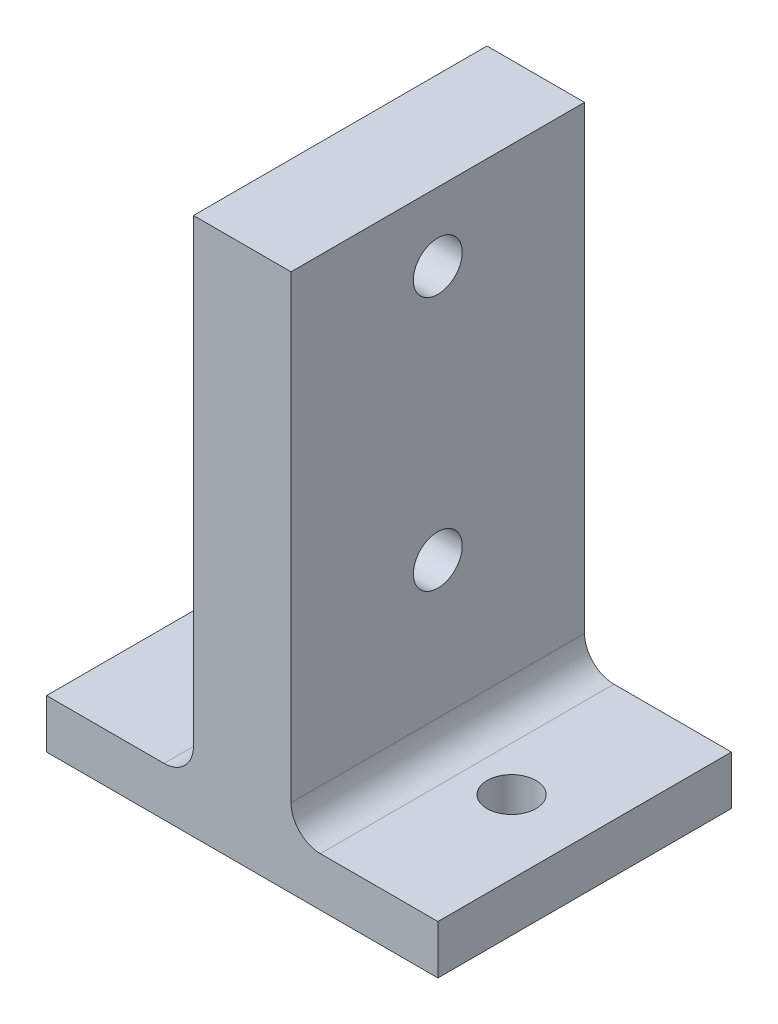
ISO-10303-21;
HEADER;
FILE_DESCRIPTION(('STEP AP214'),'2;1');
FILE_NAME('part.step','',(''),(''),'','','');
FILE_SCHEMA(('AUTOMOTIVE_DESIGN { 1 0 10303 214 1 1 1 1 }'));
ENDSEC;
DATA;
#1=APPLICATION_CONTEXT('core data for automotive mechanical design processes');
#2=APPLICATION_PROTOCOL_DEFINITION('international standard','automotive_design',2000,#1);
#3=PRODUCT_CONTEXT('',#1,'mechanical');
#4=PRODUCT('Part','Part','',(#3));
#5=PRODUCT_RELATED_PRODUCT_CATEGORY('part','',(#4));
#6=PRODUCT_DEFINITION_FORMATION('','',#4);
#7=PRODUCT_DEFINITION_CONTEXT('part definition',#1,'design');
#8=PRODUCT_DEFINITION('design','',#6,#7);
#9=PRODUCT_DEFINITION_SHAPE('','',#8);
#10=(LENGTH_UNIT() NAMED_UNIT(*) SI_UNIT(.MILLI.,.METRE.));
#11=(NAMED_UNIT(*) PLANE_ANGLE_UNIT() SI_UNIT($,.RADIAN.));
#12=(NAMED_UNIT(*) SI_UNIT($,.STERADIAN.) SOLID_ANGLE_UNIT());
#13=UNCERTAINTY_MEASURE_WITH_UNIT(LENGTH_MEASURE(1.E-05),#10,'distance_accuracy_value','');
#14=(GEOMETRIC_REPRESENTATION_CONTEXT(3) GLOBAL_UNCERTAINTY_ASSIGNED_CONTEXT((#13)) GLOBAL_UNIT_ASSIGNED_CONTEXT((#10,
#11,#12)) REPRESENTATION_CONTEXT('',''));
#15=CARTESIAN_POINT('',(0.,0.,0.));
#16=DIRECTION('',(0.,0.,1.));
#17=DIRECTION('',(1.,0.,0.));
#18=AXIS2_PLACEMENT_3D('',#15,#16,#17);
#19=CARTESIAN_POINT('',(0.,5.,0.));
#20=DIRECTION('',(0.,1.,0.));
#21=DIRECTION('',(0.,0.,1.));
#22=AXIS2_PLACEMENT_3D('',#19,#20,#21);
#23=PLANE('',#22);
#24=CARTESIAN_POINT('',(12.5257696115812,5.,0.));
#25=DIRECTION('',(0.,1.,0.));
#26=DIRECTION('',(0.,0.,1.));
#27=AXIS2_PLACEMENT_3D('',#24,#25,#26);
#28=CIRCLE('',#27,2.5);
#29=CARTESIAN_POINT('',(12.5257696115812,5.,2.5));
#30=VERTEX_POINT('',#29);
#31=EDGE_CURVE('E224',#30,#30,#28,.T.);
#32=ORIENTED_EDGE('',*,*,#31,.F.);
#33=EDGE_LOOP('',(#32));
#34=FACE_BOUND('',#33,.T.);
#35=DIRECTION('',(-1.,0.,0.));
#36=VECTOR('',#35,1.);
#37=CARTESIAN_POINT('',(-20.,5.,-15.));
#38=LINE('',#37,#36);
#39=CARTESIAN_POINT('',(20.,5.,-15.));
#40=VERTEX_POINT('',#39);
#41=CARTESIAN_POINT('',(7.9862077742931,5.,-15.));
#42=VERTEX_POINT('',#41);
#43=EDGE_CURVE('E153',#40,#42,#38,.T.);
#44=ORIENTED_EDGE('',*,*,#43,.T.);
#45=DIRECTION('',(0.,0.,-1.));
#46=VECTOR('',#45,1.);
#47=CARTESIAN_POINT('',(7.9862077742931,5.,0.));
#48=LINE('',#47,#46);
#49=CARTESIAN_POINT('',(7.9862077742931,5.,15.));
#50=VERTEX_POINT('',#49);
#51=EDGE_CURVE('E178',#42,#50,#48,.F.);
#52=ORIENTED_EDGE('',*,*,#51,.T.);
#53=DIRECTION('',(1.,0.,0.));
#54=VECTOR('',#53,1.);
#55=CARTESIAN_POINT('',(-20.,5.,15.));
#56=LINE('',#55,#54);
#57=CARTESIAN_POINT('',(20.,5.,15.));
#58=VERTEX_POINT('',#57);
#59=EDGE_CURVE('E158',#50,#58,#56,.T.);
#60=ORIENTED_EDGE('',*,*,#59,.T.);
#61=DIRECTION('',(0.,0.,-1.));
#62=VECTOR('',#61,1.);
#63=CARTESIAN_POINT('',(20.,5.,-15.));
#64=LINE('',#63,#62);
#65=EDGE_CURVE('E148',#58,#40,#64,.T.);
#66=ORIENTED_EDGE('',*,*,#65,.T.);
#67=EDGE_LOOP('',(#44,#52,#60,#66));
#68=FACE_BOUND('',#67,.T.);
#69=ADVANCED_FACE('F38',(#34,#68),#23,.T.);
#70=CARTESIAN_POINT('',(20.,5.,-15.));
#71=DIRECTION('',(-1.,0.,0.));
#72=DIRECTION('',(0.,0.,1.));
#73=AXIS2_PLACEMENT_3D('',#70,#71,#72);
#74=PLANE('',#73);
#75=DIRECTION('',(0.,0.,-1.));
#76=VECTOR('',#75,1.);
#77=CARTESIAN_POINT('',(20.,0.,-15.));
#78=LINE('',#77,#76);
#79=CARTESIAN_POINT('',(20.,0.,15.));
#80=VERTEX_POINT('',#79);
#81=CARTESIAN_POINT('',(20.,0.,-15.));
#82=VERTEX_POINT('',#81);
#83=EDGE_CURVE('E139',#80,#82,#78,.T.);
#84=ORIENTED_EDGE('',*,*,#83,.T.);
#85=DIRECTION('',(0.,-1.,0.));
#86=VECTOR('',#85,1.);
#87=CARTESIAN_POINT('',(20.,5.,-15.));
#88=LINE('',#87,#86);
#89=EDGE_CURVE('E174',#40,#82,#88,.T.);
#90=ORIENTED_EDGE('',*,*,#89,.F.);
#91=ORIENTED_EDGE('',*,*,#65,.F.);
#92=DIRECTION('',(0.,-1.,0.));
#93=VECTOR('',#92,1.);
#94=CARTESIAN_POINT('',(20.,5.,15.));
#95=LINE('',#94,#93);
#96=EDGE_CURVE('E160',#58,#80,#95,.T.);
#97=ORIENTED_EDGE('',*,*,#96,.T.);
#98=EDGE_LOOP('',(#84,#90,#91,#97));
#99=FACE_BOUND('',#98,.T.);
#100=ADVANCED_FACE('F200',(#99),#74,.F.);
#101=CARTESIAN_POINT('',(-20.,5.,-15.));
#102=DIRECTION('',(0.,0.,1.));
#103=DIRECTION('',(1.,0.,0.));
#104=AXIS2_PLACEMENT_3D('',#101,#102,#103);
#105=PLANE('',#104);
#106=DIRECTION('',(-1.,0.,0.));
#107=VECTOR('',#106,1.);
#108=CARTESIAN_POINT('',(-20.,0.,-15.));
#109=LINE('',#108,#107);
#110=CARTESIAN_POINT('',(-20.,0.,-15.));
#111=VERTEX_POINT('',#110);
#112=EDGE_CURVE('E142',#82,#111,#109,.T.);
#113=ORIENTED_EDGE('',*,*,#112,.T.);
#114=DIRECTION('',(0.,-1.,0.));
#115=VECTOR('',#114,1.);
#116=CARTESIAN_POINT('',(-20.,5.,-15.));
#117=LINE('',#116,#115);
#118=CARTESIAN_POINT('',(-20.,5.,-15.));
#119=VERTEX_POINT('',#118);
#120=EDGE_CURVE('E171',#119,#111,#117,.T.);
#121=ORIENTED_EDGE('',*,*,#120,.F.);
#122=CARTESIAN_POINT('',(-7.9862077742931,5.,-15.));
#123=VERTEX_POINT('',#122);
#124=EDGE_CURVE('E151',#123,#119,#38,.T.);
#125=ORIENTED_EDGE('',*,*,#124,.F.);
#126=CARTESIAN_POINT('',(-7.9862077742931,8.,-15.));
#127=DIRECTION('',(0.,0.,1.));
#128=DIRECTION('',(1.,0.,0.));
#129=AXIS2_PLACEMENT_3D('',#126,#127,#128);
#130=CIRCLE('',#129,3.);
#131=CARTESIAN_POINT('',(-4.9862077742931,8.,-15.));
#132=VERTEX_POINT('',#131);
#133=EDGE_CURVE('E11',#123,#132,#130,.T.);
#134=ORIENTED_EDGE('',*,*,#133,.T.);
#135=DIRECTION('',(0.,-1.,0.));
#136=VECTOR('',#135,1.);
#137=CARTESIAN_POINT('',(-4.9862077742931,55.,-15.));
#138=LINE('',#137,#136);
#139=CARTESIAN_POINT('',(-4.9862077742931,55.,-15.));
#140=VERTEX_POINT('',#139);
#141=EDGE_CURVE('E120',#140,#132,#138,.T.);
#142=ORIENTED_EDGE('',*,*,#141,.F.);
#143=DIRECTION('',(-1.,0.,0.));
#144=VECTOR('',#143,1.);
#145=CARTESIAN_POINT('',(-4.9862077742931,55.,-15.));
#146=LINE('',#145,#144);
#147=CARTESIAN_POINT('',(4.9862077742931,55.,-15.));
#148=VERTEX_POINT('',#147);
#149=EDGE_CURVE('E114',#148,#140,#146,.T.);
#150=ORIENTED_EDGE('',*,*,#149,.F.);
#151=DIRECTION('',(0.,-1.,0.));
#152=VECTOR('',#151,1.);
#153=CARTESIAN_POINT('',(4.9862077742931,55.,-15.));
#154=LINE('',#153,#152);
#155=CARTESIAN_POINT('',(4.9862077742931,8.,-15.));
#156=VERTEX_POINT('',#155);
#157=EDGE_CURVE('E118',#148,#156,#154,.T.);
#158=ORIENTED_EDGE('',*,*,#157,.T.);
#159=CARTESIAN_POINT('',(7.9862077742931,8.,-15.));
#160=DIRECTION('',(0.,0.,1.));
#161=DIRECTION('',(1.,0.,0.));
#162=AXIS2_PLACEMENT_3D('',#159,#160,#161);
#163=CIRCLE('',#162,3.);
#164=EDGE_CURVE('E184',#156,#42,#163,.T.);
#165=ORIENTED_EDGE('',*,*,#164,.T.);
#166=ORIENTED_EDGE('',*,*,#43,.F.);
#167=ORIENTED_EDGE('',*,*,#89,.T.);
#168=EDGE_LOOP('',(#113,#121,#125,#134,#142,#150,#158,#165,#166,#167));
#169=FACE_BOUND('',#168,.T.);
#170=ADVANCED_FACE('F116',(#169),#105,.F.);
#171=CARTESIAN_POINT('',(-20.,5.,-15.));
#172=DIRECTION('',(1.,0.,0.));
#173=DIRECTION('',(0.,0.,-1.));
#174=AXIS2_PLACEMENT_3D('',#171,#172,#173);
#175=PLANE('',#174);
#176=DIRECTION('',(0.,0.,1.));
#177=VECTOR('',#176,1.);
#178=CARTESIAN_POINT('',(-20.,0.,-15.));
#179=LINE('',#178,#177);
#180=CARTESIAN_POINT('',(-20.,0.,15.));
#181=VERTEX_POINT('',#180);
#182=EDGE_CURVE('E163',#111,#181,#179,.T.);
#183=ORIENTED_EDGE('',*,*,#182,.T.);
#184=DIRECTION('',(0.,-1.,0.));
#185=VECTOR('',#184,1.);
#186=CARTESIAN_POINT('',(-20.,5.,15.));
#187=LINE('',#186,#185);
#188=CARTESIAN_POINT('',(-20.,5.,15.));
#189=VERTEX_POINT('',#188);
#190=EDGE_CURVE('E168',#189,#181,#187,.T.);
#191=ORIENTED_EDGE('',*,*,#190,.F.);
#192=DIRECTION('',(0.,0.,1.));
#193=VECTOR('',#192,1.);
#194=CARTESIAN_POINT('',(-20.,5.,-15.));
#195=LINE('',#194,#193);
#196=EDGE_CURVE('E156',#119,#189,#195,.T.);
#197=ORIENTED_EDGE('',*,*,#196,.F.);
#198=ORIENTED_EDGE('',*,*,#120,.T.);
#199=EDGE_LOOP('',(#183,#191,#197,#198));
#200=FACE_BOUND('',#199,.T.);
#201=ADVANCED_FACE('F207',(#200),#175,.F.);
#202=CARTESIAN_POINT('',(-20.,5.,15.));
#203=DIRECTION('',(0.,0.,-1.));
#204=DIRECTION('',(-1.,0.,0.));
#205=AXIS2_PLACEMENT_3D('',#202,#203,#204);
#206=PLANE('',#205);
#207=DIRECTION('',(1.,0.,0.));
#208=VECTOR('',#207,1.);
#209=CARTESIAN_POINT('',(-20.,0.,15.));
#210=LINE('',#209,#208);
#211=EDGE_CURVE('E152',#181,#80,#210,.T.);
#212=ORIENTED_EDGE('',*,*,#211,.T.);
#213=ORIENTED_EDGE('',*,*,#96,.F.);
#214=ORIENTED_EDGE('',*,*,#59,.F.);
#215=CARTESIAN_POINT('',(7.9862077742931,8.,15.));
#216=DIRECTION('',(0.,0.,-1.));
#217=DIRECTION('',(-1.,0.,0.));
#218=AXIS2_PLACEMENT_3D('',#215,#216,#217);
#219=CIRCLE('',#218,3.);
#220=CARTESIAN_POINT('',(4.9862077742931,8.,15.));
#221=VERTEX_POINT('',#220);
#222=EDGE_CURVE('E186',#50,#221,#219,.T.);
#223=ORIENTED_EDGE('',*,*,#222,.T.);
#224=DIRECTION('',(0.,-1.,0.));
#225=VECTOR('',#224,1.);
#226=CARTESIAN_POINT('',(4.9862077742931,55.,15.));
#227=LINE('',#226,#225);
#228=CARTESIAN_POINT('',(4.9862077742931,55.,15.));
#229=VERTEX_POINT('',#228);
#230=EDGE_CURVE('E190',#229,#221,#227,.T.);
#231=ORIENTED_EDGE('',*,*,#230,.F.);
#232=DIRECTION('',(1.,0.,0.));
#233=VECTOR('',#232,1.);
#234=CARTESIAN_POINT('',(-4.9862077742931,55.,15.));
#235=LINE('',#234,#233);
#236=CARTESIAN_POINT('',(-4.9862077742931,55.,15.));
#237=VERTEX_POINT('',#236);
#238=EDGE_CURVE('E129',#237,#229,#235,.T.);
#239=ORIENTED_EDGE('',*,*,#238,.F.);
#240=DIRECTION('',(0.,-1.,0.));
#241=VECTOR('',#240,1.);
#242=CARTESIAN_POINT('',(-4.9862077742931,55.,15.));
#243=LINE('',#242,#241);
#244=CARTESIAN_POINT('',(-4.9862077742931,8.,15.));
#245=VERTEX_POINT('',#244);
#246=EDGE_CURVE('E144',#237,#245,#243,.T.);
#247=ORIENTED_EDGE('',*,*,#246,.T.);
#248=CARTESIAN_POINT('',(-7.9862077742931,8.,15.));
#249=DIRECTION('',(0.,0.,-1.));
#250=DIRECTION('',(-1.,0.,0.));
#251=AXIS2_PLACEMENT_3D('',#248,#249,#250);
#252=CIRCLE('',#251,3.);
#253=CARTESIAN_POINT('',(-7.9862077742931,5.,15.));
#254=VERTEX_POINT('',#253);
#255=EDGE_CURVE('E46',#245,#254,#252,.T.);
#256=ORIENTED_EDGE('',*,*,#255,.T.);
#257=EDGE_CURVE('E159',#189,#254,#56,.T.);
#258=ORIENTED_EDGE('',*,*,#257,.F.);
#259=ORIENTED_EDGE('',*,*,#190,.T.);
#260=EDGE_LOOP('',(#212,#213,#214,#223,#231,#239,#247,#256,#258,#259));
#261=FACE_BOUND('',#260,.T.);
#262=ADVANCED_FACE('F189',(#261),#206,.F.);
#263=CARTESIAN_POINT('',(-12.5257696115812,5.,0.));
#264=DIRECTION('',(0.,1.,0.));
#265=DIRECTION('',(0.,0.,1.));
#266=AXIS2_PLACEMENT_3D('',#263,#264,#265);
#267=CIRCLE('',#266,2.5);
#268=CARTESIAN_POINT('',(-12.5257696115812,5.,2.5));
#269=VERTEX_POINT('',#268);
#270=EDGE_CURVE('E228',#269,#269,#267,.T.);
#271=ORIENTED_EDGE('',*,*,#270,.F.);
#272=EDGE_LOOP('',(#271));
#273=FACE_BOUND('',#272,.T.);
#274=ORIENTED_EDGE('',*,*,#257,.T.);
#275=DIRECTION('',(0.,0.,1.));
#276=VECTOR('',#275,1.);
#277=CARTESIAN_POINT('',(-7.9862077742931,5.,0.));
#278=LINE('',#277,#276);
#279=EDGE_CURVE('E59',#254,#123,#278,.F.);
#280=ORIENTED_EDGE('',*,*,#279,.T.);
#281=ORIENTED_EDGE('',*,*,#124,.T.);
#282=ORIENTED_EDGE('',*,*,#196,.T.);
#283=EDGE_LOOP('',(#274,#280,#281,#282));
#284=FACE_BOUND('',#283,.T.);
#285=ADVANCED_FACE('F211',(#273,#284),#23,.T.);
#286=CARTESIAN_POINT('',(0.,0.,0.));
#287=DIRECTION('',(0.,1.,0.));
#288=DIRECTION('',(0.,0.,1.));
#289=AXIS2_PLACEMENT_3D('',#286,#287,#288);
#290=PLANE('',#289);
#291=CARTESIAN_POINT('',(-12.5257696115812,0.,0.));
#292=DIRECTION('',(0.,1.,0.));
#293=DIRECTION('',(0.,0.,1.));
#294=AXIS2_PLACEMENT_3D('',#291,#292,#293);
#295=CIRCLE('',#294,2.5);
#296=CARTESIAN_POINT('',(-12.5257696115812,0.,2.5));
#297=VERTEX_POINT('',#296);
#298=EDGE_CURVE('E133',#297,#297,#295,.T.);
#299=ORIENTED_EDGE('',*,*,#298,.T.);
#300=EDGE_LOOP('',(#299));
#301=FACE_BOUND('',#300,.T.);
#302=CARTESIAN_POINT('',(12.5257696115812,0.,0.));
#303=DIRECTION('',(0.,1.,0.));
#304=DIRECTION('',(0.,0.,1.));
#305=AXIS2_PLACEMENT_3D('',#302,#303,#304);
#306=CIRCLE('',#305,2.5);
#307=CARTESIAN_POINT('',(12.5257696115812,0.,2.5));
#308=VERTEX_POINT('',#307);
#309=EDGE_CURVE('E221',#308,#308,#306,.T.);
#310=ORIENTED_EDGE('',*,*,#309,.T.);
#311=EDGE_LOOP('',(#310));
#312=FACE_BOUND('',#311,.T.);
#313=ORIENTED_EDGE('',*,*,#83,.F.);
#314=ORIENTED_EDGE('',*,*,#211,.F.);
#315=ORIENTED_EDGE('',*,*,#182,.F.);
#316=ORIENTED_EDGE('',*,*,#112,.F.);
#317=EDGE_LOOP('',(#313,#314,#315,#316));
#318=FACE_BOUND('',#317,.T.);
#319=ADVANCED_FACE('F210',(#301,#312,#318),#290,.F.);
#320=CARTESIAN_POINT('',(4.9862077742931,55.,-15.));
#321=DIRECTION('',(-1.,0.,0.));
#322=DIRECTION('',(0.,0.,1.));
#323=AXIS2_PLACEMENT_3D('',#320,#321,#322);
#324=PLANE('',#323);
#325=CARTESIAN_POINT('',(4.9862077742931,22.,0.));
#326=DIRECTION('',(-1.,0.,0.));
#327=DIRECTION('',(0.,0.,1.));
#328=AXIS2_PLACEMENT_3D('',#325,#326,#327);
#329=CIRCLE('',#328,2.5);
#330=CARTESIAN_POINT('',(4.9862077742931,22.,2.5));
#331=VERTEX_POINT('',#330);
#332=EDGE_CURVE('E225',#331,#331,#329,.F.);
#333=ORIENTED_EDGE('',*,*,#332,.F.);
#334=EDGE_LOOP('',(#333));
#335=FACE_BOUND('',#334,.T.);
#336=CARTESIAN_POINT('',(4.9862077742931,48.,0.));
#337=DIRECTION('',(-1.,0.,0.));
#338=DIRECTION('',(0.,0.,1.));
#339=AXIS2_PLACEMENT_3D('',#336,#337,#338);
#340=CIRCLE('',#339,2.5);
#341=CARTESIAN_POINT('',(4.9862077742931,48.,2.5));
#342=VERTEX_POINT('',#341);
#343=EDGE_CURVE('E237',#342,#342,#340,.F.);
#344=ORIENTED_EDGE('',*,*,#343,.F.);
#345=EDGE_LOOP('',(#344));
#346=FACE_BOUND('',#345,.T.);
#347=ORIENTED_EDGE('',*,*,#230,.T.);
#348=DIRECTION('',(0.,0.,-1.));
#349=VECTOR('',#348,1.);
#350=CARTESIAN_POINT('',(4.9862077742931,8.,-15.));
#351=LINE('',#350,#349);
#352=EDGE_CURVE('E138',#221,#156,#351,.T.);
#353=ORIENTED_EDGE('',*,*,#352,.T.);
#354=ORIENTED_EDGE('',*,*,#157,.F.);
#355=DIRECTION('',(0.,0.,-1.));
#356=VECTOR('',#355,1.);
#357=CARTESIAN_POINT('',(4.9862077742931,55.,-15.));
#358=LINE('',#357,#356);
#359=EDGE_CURVE('E124',#229,#148,#358,.T.);
#360=ORIENTED_EDGE('',*,*,#359,.F.);
#361=EDGE_LOOP('',(#347,#353,#354,#360));
#362=FACE_BOUND('',#361,.T.);
#363=ADVANCED_FACE('F136',(#335,#346,#362),#324,.F.);
#364=CARTESIAN_POINT('',(-4.9862077742931,55.,-15.));
#365=DIRECTION('',(1.,0.,0.));
#366=DIRECTION('',(0.,0.,-1.));
#367=AXIS2_PLACEMENT_3D('',#364,#365,#366);
#368=PLANE('',#367);
#369=CARTESIAN_POINT('',(-4.9862077742931,22.,0.));
#370=DIRECTION('',(-1.,0.,0.));
#371=DIRECTION('',(0.,0.,1.));
#372=AXIS2_PLACEMENT_3D('',#369,#370,#371);
#373=CIRCLE('',#372,2.5);
#374=CARTESIAN_POINT('',(-4.9862077742931,22.,2.5));
#375=VERTEX_POINT('',#374);
#376=EDGE_CURVE('E236',#375,#375,#373,.T.);
#377=ORIENTED_EDGE('',*,*,#376,.F.);
#378=EDGE_LOOP('',(#377));
#379=FACE_BOUND('',#378,.T.);
#380=CARTESIAN_POINT('',(-4.9862077742931,48.,0.));
#381=DIRECTION('',(-1.,0.,0.));
#382=DIRECTION('',(0.,0.,1.));
#383=AXIS2_PLACEMENT_3D('',#380,#381,#382);
#384=CIRCLE('',#383,2.5);
#385=CARTESIAN_POINT('',(-4.9862077742931,48.,2.5));
#386=VERTEX_POINT('',#385);
#387=EDGE_CURVE('E233',#386,#386,#384,.T.);
#388=ORIENTED_EDGE('',*,*,#387,.F.);
#389=EDGE_LOOP('',(#388));
#390=FACE_BOUND('',#389,.T.);
#391=ORIENTED_EDGE('',*,*,#141,.T.);
#392=DIRECTION('',(0.,0.,1.));
#393=VECTOR('',#392,1.);
#394=CARTESIAN_POINT('',(-4.9862077742931,8.,-15.));
#395=LINE('',#394,#393);
#396=EDGE_CURVE('E180',#132,#245,#395,.T.);
#397=ORIENTED_EDGE('',*,*,#396,.T.);
#398=ORIENTED_EDGE('',*,*,#246,.F.);
#399=DIRECTION('',(0.,0.,1.));
#400=VECTOR('',#399,1.);
#401=CARTESIAN_POINT('',(-4.9862077742931,55.,-15.));
#402=LINE('',#401,#400);
#403=EDGE_CURVE('E123',#140,#237,#402,.T.);
#404=ORIENTED_EDGE('',*,*,#403,.F.);
#405=EDGE_LOOP('',(#391,#397,#398,#404));
#406=FACE_BOUND('',#405,.T.);
#407=ADVANCED_FACE('F216',(#379,#390,#406),#368,.F.);
#408=CARTESIAN_POINT('',(0.,55.,0.));
#409=DIRECTION('',(0.,1.,0.));
#410=DIRECTION('',(0.,0.,1.));
#411=AXIS2_PLACEMENT_3D('',#408,#409,#410);
#412=PLANE('',#411);
#413=ORIENTED_EDGE('',*,*,#359,.T.);
#414=ORIENTED_EDGE('',*,*,#149,.T.);
#415=ORIENTED_EDGE('',*,*,#403,.T.);
#416=ORIENTED_EDGE('',*,*,#238,.T.);
#417=EDGE_LOOP('',(#413,#414,#415,#416));
#418=FACE_BOUND('',#417,.T.);
#419=ADVANCED_FACE('F127',(#418),#412,.T.);
#420=CARTESIAN_POINT('',(12.5257696115812,0.,0.));
#421=DIRECTION('',(0.,1.,0.));
#422=DIRECTION('',(0.,0.,1.));
#423=AXIS2_PLACEMENT_3D('',#420,#421,#422);
#424=CYLINDRICAL_SURFACE('',#423,2.5);
#425=ORIENTED_EDGE('',*,*,#309,.F.);
#426=EDGE_LOOP('',(#425));
#427=FACE_BOUND('',#426,.T.);
#428=ORIENTED_EDGE('',*,*,#31,.T.);
#429=EDGE_LOOP('',(#428));
#430=FACE_BOUND('',#429,.T.);
#431=ADVANCED_FACE('F286',(#427,#430),#424,.F.);
#432=CARTESIAN_POINT('',(-12.5257696115812,0.,0.));
#433=DIRECTION('',(0.,1.,0.));
#434=DIRECTION('',(0.,0.,1.));
#435=AXIS2_PLACEMENT_3D('',#432,#433,#434);
#436=CYLINDRICAL_SURFACE('',#435,2.5);
#437=ORIENTED_EDGE('',*,*,#298,.F.);
#438=EDGE_LOOP('',(#437));
#439=FACE_BOUND('',#438,.T.);
#440=ORIENTED_EDGE('',*,*,#270,.T.);
#441=EDGE_LOOP('',(#440));
#442=FACE_BOUND('',#441,.T.);
#443=ADVANCED_FACE('F256',(#439,#442),#436,.F.);
#444=CARTESIAN_POINT('',(20.001,48.,0.));
#445=DIRECTION('',(-1.,0.,0.));
#446=DIRECTION('',(0.,0.,1.));
#447=AXIS2_PLACEMENT_3D('',#444,#445,#446);
#448=CYLINDRICAL_SURFACE('',#447,2.5);
#449=ORIENTED_EDGE('',*,*,#387,.T.);
#450=EDGE_LOOP('',(#449));
#451=FACE_BOUND('',#450,.T.);
#452=ORIENTED_EDGE('',*,*,#343,.T.);
#453=EDGE_LOOP('',(#452));
#454=FACE_BOUND('',#453,.T.);
#455=ADVANCED_FACE('F253',(#451,#454),#448,.F.);
#456=CARTESIAN_POINT('',(20.001,22.,0.));
#457=DIRECTION('',(-1.,0.,0.));
#458=DIRECTION('',(0.,0.,1.));
#459=AXIS2_PLACEMENT_3D('',#456,#457,#458);
#460=CYLINDRICAL_SURFACE('',#459,2.5);
#461=ORIENTED_EDGE('',*,*,#376,.T.);
#462=EDGE_LOOP('',(#461));
#463=FACE_BOUND('',#462,.T.);
#464=ORIENTED_EDGE('',*,*,#332,.T.);
#465=EDGE_LOOP('',(#464));
#466=FACE_BOUND('',#465,.T.);
#467=ADVANCED_FACE('F245',(#463,#466),#460,.F.);
#468=CARTESIAN_POINT('',(7.9862077742931,8.,-15.));
#469=DIRECTION('',(0.,0.,-1.));
#470=DIRECTION('',(-1.,0.,0.));
#471=AXIS2_PLACEMENT_3D('',#468,#469,#470);
#472=CYLINDRICAL_SURFACE('',#471,3.);
#473=ORIENTED_EDGE('',*,*,#222,.F.);
#474=ORIENTED_EDGE('',*,*,#51,.F.);
#475=ORIENTED_EDGE('',*,*,#164,.F.);
#476=ORIENTED_EDGE('',*,*,#352,.F.);
#477=EDGE_LOOP('',(#473,#474,#475,#476));
#478=FACE_BOUND('',#477,.T.);
#479=ADVANCED_FACE('F195',(#478),#472,.F.);
#480=CARTESIAN_POINT('',(-7.9862077742931,8.,-15.));
#481=DIRECTION('',(0.,0.,1.));
#482=DIRECTION('',(1.,0.,0.));
#483=AXIS2_PLACEMENT_3D('',#480,#481,#482);
#484=CYLINDRICAL_SURFACE('',#483,3.);
#485=ORIENTED_EDGE('',*,*,#133,.F.);
#486=ORIENTED_EDGE('',*,*,#279,.F.);
#487=ORIENTED_EDGE('',*,*,#255,.F.);
#488=ORIENTED_EDGE('',*,*,#396,.F.);
#489=EDGE_LOOP('',(#485,#486,#487,#488));
#490=FACE_BOUND('',#489,.T.);
#491=ADVANCED_FACE('F40',(#490),#484,.F.);
#492=CLOSED_SHELL('',(#69,#100,#170,#201,#262,#285,#319,#363,#407,#419,#431,#443,#455,#467,#479,#491));
#493=MANIFOLD_SOLID_BREP('B2',#492);
#494=ADVANCED_BREP_SHAPE_REPRESENTATION('',(#18,#493),#14);
#495=SHAPE_DEFINITION_REPRESENTATION(#9,#494);
ENDSEC;
END-ISO-10303-21;
